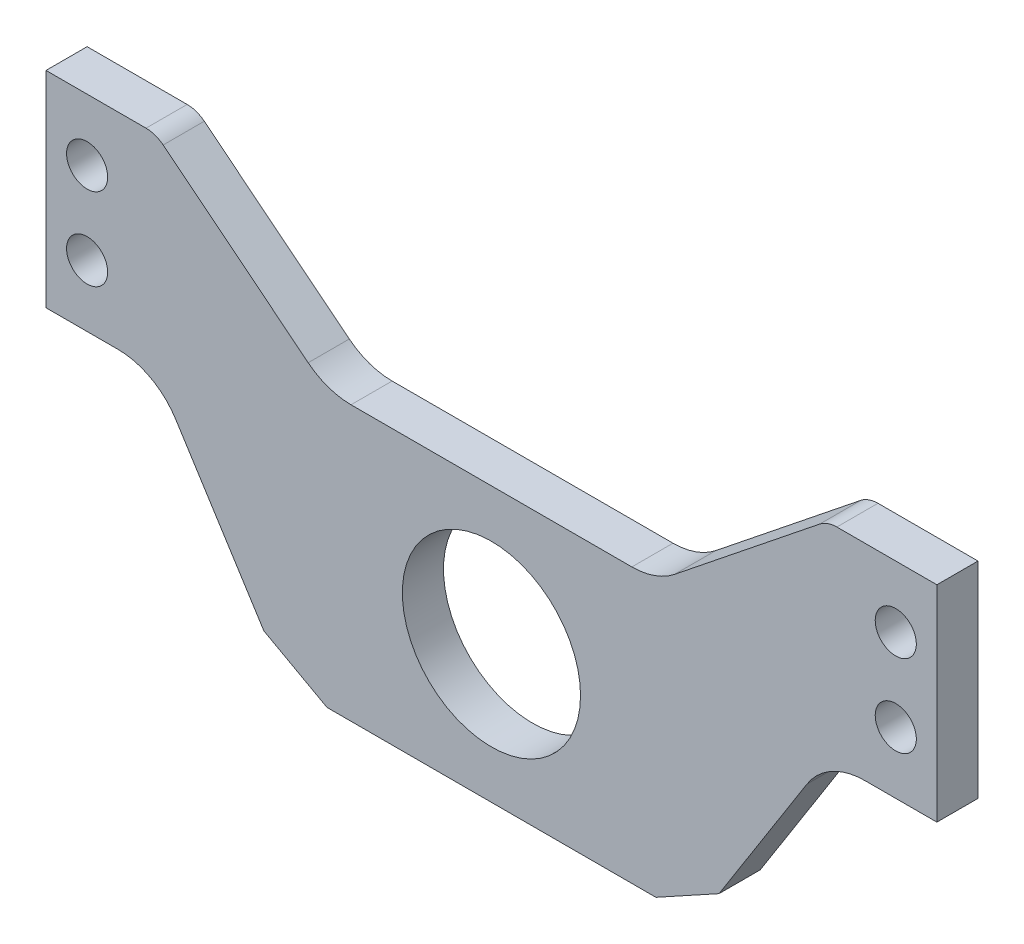
ISO-10303-21;
HEADER;
FILE_DESCRIPTION(('STEP AP214'),'2;1');
FILE_NAME('part.step','',(''),(''),'','','');
FILE_SCHEMA(('AUTOMOTIVE_DESIGN { 1 0 10303 214 1 1 1 1 }'));
ENDSEC;
DATA;
#1=APPLICATION_CONTEXT('core data for automotive mechanical design processes');
#2=APPLICATION_PROTOCOL_DEFINITION('international standard','automotive_design',2000,#1);
#3=PRODUCT_CONTEXT('',#1,'mechanical');
#4=PRODUCT('Part','Part','',(#3));
#5=PRODUCT_RELATED_PRODUCT_CATEGORY('part','',(#4));
#6=PRODUCT_DEFINITION_FORMATION('','',#4);
#7=PRODUCT_DEFINITION_CONTEXT('part definition',#1,'design');
#8=PRODUCT_DEFINITION('design','',#6,#7);
#9=PRODUCT_DEFINITION_SHAPE('','',#8);
#10=(LENGTH_UNIT() NAMED_UNIT(*) SI_UNIT(.MILLI.,.METRE.));
#11=(NAMED_UNIT(*) PLANE_ANGLE_UNIT() SI_UNIT($,.RADIAN.));
#12=(NAMED_UNIT(*) SI_UNIT($,.STERADIAN.) SOLID_ANGLE_UNIT());
#13=UNCERTAINTY_MEASURE_WITH_UNIT(LENGTH_MEASURE(1.E-05),#10,'distance_accuracy_value','');
#14=(GEOMETRIC_REPRESENTATION_CONTEXT(3) GLOBAL_UNCERTAINTY_ASSIGNED_CONTEXT((#13)) GLOBAL_UNIT_ASSIGNED_CONTEXT((#10,
#11,#12)) REPRESENTATION_CONTEXT('',''));
#15=CARTESIAN_POINT('',(0.,0.,0.));
#16=DIRECTION('',(0.,0.,1.));
#17=DIRECTION('',(1.,0.,0.));
#18=AXIS2_PLACEMENT_3D('',#15,#16,#17);
#19=CARTESIAN_POINT('',(0.,0.,3.));
#20=DIRECTION('',(0.,0.,-1.));
#21=DIRECTION('',(-1.,0.,0.));
#22=AXIS2_PLACEMENT_3D('',#19,#20,#21);
#23=PLANE('',#22);
#24=DIRECTION('',(-1.,0.,0.));
#25=VECTOR('',#24,1.);
#26=CARTESIAN_POINT('',(24.5,20.,3.));
#27=LINE('',#26,#25);
#28=CARTESIAN_POINT('',(32.5,20.,3.));
#29=VERTEX_POINT('',#28);
#30=CARTESIAN_POINT('',(25.2015621187164,20.,3.));
#31=VERTEX_POINT('',#30);
#32=EDGE_CURVE('E197',#29,#31,#27,.T.);
#33=ORIENTED_EDGE('',*,*,#32,.T.);
#34=CARTESIAN_POINT('',(25.2015621187164,18.,3.));
#35=DIRECTION('',(0.,0.,-1.));
#36=DIRECTION('',(-1.,0.,0.));
#37=AXIS2_PLACEMENT_3D('',#34,#35,#36);
#38=CIRCLE('',#37,2.);
#39=CARTESIAN_POINT('',(23.9521720236076,19.5617376188861,3.));
#40=VERTEX_POINT('',#39);
#41=EDGE_CURVE('E318',#31,#40,#38,.F.);
#42=ORIENTED_EDGE('',*,*,#41,.T.);
#43=DIRECTION('',(-0.78086880944303,-0.624695047554424,0.));
#44=VECTOR('',#43,1.);
#45=CARTESIAN_POINT('',(12.,10.,3.));
#46=LINE('',#45,#44);
#47=CARTESIAN_POINT('',(13.3695699409811,11.0956559527848,3.));
#48=VERTEX_POINT('',#47);
#49=EDGE_CURVE('E199',#40,#48,#46,.T.);
#50=ORIENTED_EDGE('',*,*,#49,.T.);
#51=CARTESIAN_POINT('',(10.2460947032089,15.,3.));
#52=DIRECTION('',(0.,0.,-1.));
#53=DIRECTION('',(-1.,0.,0.));
#54=AXIS2_PLACEMENT_3D('',#51,#52,#53);
#55=CIRCLE('',#54,5.);
#56=CARTESIAN_POINT('',(10.2460947032089,10.,3.));
#57=VERTEX_POINT('',#56);
#58=EDGE_CURVE('E266',#48,#57,#55,.T.);
#59=ORIENTED_EDGE('',*,*,#58,.T.);
#60=DIRECTION('',(-1.,0.,0.));
#61=VECTOR('',#60,1.);
#62=CARTESIAN_POINT('',(12.,10.,3.));
#63=LINE('',#62,#61);
#64=CARTESIAN_POINT('',(-10.2460947032089,10.,3.));
#65=VERTEX_POINT('',#64);
#66=EDGE_CURVE('E204',#57,#65,#63,.T.);
#67=ORIENTED_EDGE('',*,*,#66,.T.);
#68=CARTESIAN_POINT('',(-10.2460947032089,15.,3.));
#69=DIRECTION('',(0.,0.,-1.));
#70=DIRECTION('',(-1.,0.,0.));
#71=AXIS2_PLACEMENT_3D('',#68,#69,#70);
#72=CIRCLE('',#71,5.);
#73=CARTESIAN_POINT('',(-13.3695699409811,11.0956559527848,3.));
#74=VERTEX_POINT('',#73);
#75=EDGE_CURVE('E270',#65,#74,#72,.T.);
#76=ORIENTED_EDGE('',*,*,#75,.T.);
#77=DIRECTION('',(-0.78086880944303,0.624695047554424,0.));
#78=VECTOR('',#77,1.);
#79=CARTESIAN_POINT('',(-12.,10.,3.));
#80=LINE('',#79,#78);
#81=CARTESIAN_POINT('',(-23.9521720236076,19.5617376188861,3.));
#82=VERTEX_POINT('',#81);
#83=EDGE_CURVE('E207',#74,#82,#80,.T.);
#84=ORIENTED_EDGE('',*,*,#83,.T.);
#85=CARTESIAN_POINT('',(-25.2015621187164,18.,3.));
#86=DIRECTION('',(0.,0.,-1.));
#87=DIRECTION('',(-1.,0.,0.));
#88=AXIS2_PLACEMENT_3D('',#85,#86,#87);
#89=CIRCLE('',#88,2.);
#90=CARTESIAN_POINT('',(-25.2015621187164,20.,3.));
#91=VERTEX_POINT('',#90);
#92=EDGE_CURVE('E49',#82,#91,#89,.F.);
#93=ORIENTED_EDGE('',*,*,#92,.T.);
#94=DIRECTION('',(-1.,0.,0.));
#95=VECTOR('',#94,1.);
#96=CARTESIAN_POINT('',(-24.5,20.,3.));
#97=LINE('',#96,#95);
#98=CARTESIAN_POINT('',(-32.5,20.,3.));
#99=VERTEX_POINT('',#98);
#100=EDGE_CURVE('E209',#91,#99,#97,.T.);
#101=ORIENTED_EDGE('',*,*,#100,.T.);
#102=DIRECTION('',(0.,-1.,0.));
#103=VECTOR('',#102,1.);
#104=CARTESIAN_POINT('',(-32.5,20.,3.));
#105=LINE('',#104,#103);
#106=CARTESIAN_POINT('',(-32.5,4.99999999999999,3.));
#107=VERTEX_POINT('',#106);
#108=EDGE_CURVE('E211',#99,#107,#105,.T.);
#109=ORIENTED_EDGE('',*,*,#108,.T.);
#110=DIRECTION('',(1.,0.,0.));
#111=VECTOR('',#110,1.);
#112=CARTESIAN_POINT('',(-32.5,4.99999999999999,3.));
#113=LINE('',#112,#111);
#114=CARTESIAN_POINT('',(-27.2517603015216,4.99999999999999,3.));
#115=VERTEX_POINT('',#114);
#116=EDGE_CURVE('E213',#107,#115,#113,.T.);
#117=ORIENTED_EDGE('',*,*,#116,.T.);
#118=CARTESIAN_POINT('',(-27.2517603015216,0.,3.));
#119=DIRECTION('',(0.,0.,-1.));
#120=DIRECTION('',(-1.,0.,0.));
#121=AXIS2_PLACEMENT_3D('',#118,#119,#120);
#122=CIRCLE('',#121,5.);
#123=CARTESIAN_POINT('',(-23.0276649237504,2.67526040592171,3.));
#124=VERTEX_POINT('',#123);
#125=EDGE_CURVE('E306',#115,#124,#122,.T.);
#126=ORIENTED_EDGE('',*,*,#125,.T.);
#127=DIRECTION('',(0.535052081184345,-0.844819075554228,0.));
#128=VECTOR('',#127,1.);
#129=CARTESIAN_POINT('',(-15.,-10.,3.));
#130=LINE('',#129,#128);
#131=CARTESIAN_POINT('',(-16.605156243553,-7.46554277333729,3.));
#132=VERTEX_POINT('',#131);
#133=EDGE_CURVE('E246',#124,#132,#130,.T.);
#134=ORIENTED_EDGE('',*,*,#133,.T.);
#135=DIRECTION('',(-0.876085635421659,0.482155534457324,0.));
#136=VECTOR('',#135,1.);
#137=CARTESIAN_POINT('',(-12.,-10.,3.));
#138=LINE('',#137,#136);
#139=CARTESIAN_POINT('',(-12.,-10.,3.));
#140=VERTEX_POINT('',#139);
#141=EDGE_CURVE('E285',#132,#140,#138,.F.);
#142=ORIENTED_EDGE('',*,*,#141,.T.);
#143=DIRECTION('',(1.,0.,0.));
#144=VECTOR('',#143,1.);
#145=CARTESIAN_POINT('',(15.,-10.,3.));
#146=LINE('',#145,#144);
#147=CARTESIAN_POINT('',(12.,-10.,3.));
#148=VERTEX_POINT('',#147);
#149=EDGE_CURVE('E357',#140,#148,#146,.T.);
#150=ORIENTED_EDGE('',*,*,#149,.T.);
#151=DIRECTION('',(-0.876085635421659,-0.482155534457325,0.));
#152=VECTOR('',#151,1.);
#153=CARTESIAN_POINT('',(16.6051562435531,-7.46554277333729,3.));
#154=LINE('',#153,#152);
#155=CARTESIAN_POINT('',(16.6051562435531,-7.46554277333729,3.));
#156=VERTEX_POINT('',#155);
#157=EDGE_CURVE('E287',#148,#156,#154,.F.);
#158=ORIENTED_EDGE('',*,*,#157,.T.);
#159=DIRECTION('',(0.535052081184345,0.844819075554228,0.));
#160=VECTOR('',#159,1.);
#161=CARTESIAN_POINT('',(15.,-10.,3.));
#162=LINE('',#161,#160);
#163=CARTESIAN_POINT('',(23.0276649237504,2.67526040592173,3.));
#164=VERTEX_POINT('',#163);
#165=EDGE_CURVE('E182',#156,#164,#162,.T.);
#166=ORIENTED_EDGE('',*,*,#165,.T.);
#167=CARTESIAN_POINT('',(27.2517603015216,0.,3.));
#168=DIRECTION('',(0.,0.,-1.));
#169=DIRECTION('',(-1.,0.,0.));
#170=AXIS2_PLACEMENT_3D('',#167,#168,#169);
#171=CIRCLE('',#170,5.);
#172=CARTESIAN_POINT('',(27.2517603015216,5.,3.));
#173=VERTEX_POINT('',#172);
#174=EDGE_CURVE('E178',#164,#173,#171,.T.);
#175=ORIENTED_EDGE('',*,*,#174,.T.);
#176=DIRECTION('',(1.,0.,0.));
#177=VECTOR('',#176,1.);
#178=CARTESIAN_POINT('',(32.5,5.,3.));
#179=LINE('',#178,#177);
#180=CARTESIAN_POINT('',(32.5,5.,3.));
#181=VERTEX_POINT('',#180);
#182=EDGE_CURVE('E169',#173,#181,#179,.T.);
#183=ORIENTED_EDGE('',*,*,#182,.T.);
#184=DIRECTION('',(0.,1.,0.));
#185=VECTOR('',#184,1.);
#186=CARTESIAN_POINT('',(32.5,20.,3.));
#187=LINE('',#186,#185);
#188=EDGE_CURVE('E174',#181,#29,#187,.T.);
#189=ORIENTED_EDGE('',*,*,#188,.T.);
#190=EDGE_LOOP('',(#33,#42,#50,#59,#67,#76,#84,#93,#101,#109,#117,#126,#134,#142,#150,#158,#166,
#175,#183,#189));
#191=FACE_BOUND('',#190,.T.);
#192=CARTESIAN_POINT('',(0.,0.,3.));
#193=DIRECTION('',(0.,0.,1.));
#194=DIRECTION('',(1.,0.,0.));
#195=AXIS2_PLACEMENT_3D('',#192,#193,#194);
#196=CIRCLE('',#195,6.5);
#197=CARTESIAN_POINT('',(6.5,0.,3.));
#198=VERTEX_POINT('',#197);
#199=EDGE_CURVE('E220',#198,#198,#196,.T.);
#200=ORIENTED_EDGE('',*,*,#199,.F.);
#201=EDGE_LOOP('',(#200));
#202=FACE_BOUND('',#201,.T.);
#203=CARTESIAN_POINT('',(-29.5,15.5,3.));
#204=DIRECTION('',(0.,0.,1.));
#205=DIRECTION('',(1.,0.,0.));
#206=AXIS2_PLACEMENT_3D('',#203,#204,#205);
#207=CIRCLE('',#206,1.5);
#208=CARTESIAN_POINT('',(-28.,15.5,3.));
#209=VERTEX_POINT('',#208);
#210=EDGE_CURVE('E368',#209,#209,#207,.T.);
#211=ORIENTED_EDGE('',*,*,#210,.F.);
#212=EDGE_LOOP('',(#211));
#213=FACE_BOUND('',#212,.T.);
#214=CARTESIAN_POINT('',(-29.5,9.49999999999999,3.));
#215=DIRECTION('',(0.,0.,1.));
#216=DIRECTION('',(1.,0.,0.));
#217=AXIS2_PLACEMENT_3D('',#214,#215,#216);
#218=CIRCLE('',#217,1.5);
#219=CARTESIAN_POINT('',(-28.,9.49999999999999,3.));
#220=VERTEX_POINT('',#219);
#221=EDGE_CURVE('E374',#220,#220,#218,.T.);
#222=ORIENTED_EDGE('',*,*,#221,.F.);
#223=EDGE_LOOP('',(#222));
#224=FACE_BOUND('',#223,.T.);
#225=CARTESIAN_POINT('',(29.5,9.5,3.));
#226=DIRECTION('',(0.,0.,1.));
#227=DIRECTION('',(-1.,0.,0.));
#228=AXIS2_PLACEMENT_3D('',#225,#226,#227);
#229=CIRCLE('',#228,1.5);
#230=CARTESIAN_POINT('',(28.,9.5,3.));
#231=VERTEX_POINT('',#230);
#232=EDGE_CURVE('E380',#231,#231,#229,.T.);
#233=ORIENTED_EDGE('',*,*,#232,.F.);
#234=EDGE_LOOP('',(#233));
#235=FACE_BOUND('',#234,.T.);
#236=CARTESIAN_POINT('',(29.5,15.5,3.));
#237=DIRECTION('',(0.,0.,1.));
#238=DIRECTION('',(-1.,0.,0.));
#239=AXIS2_PLACEMENT_3D('',#236,#237,#238);
#240=CIRCLE('',#239,1.5);
#241=CARTESIAN_POINT('',(28.,15.5,3.));
#242=VERTEX_POINT('',#241);
#243=EDGE_CURVE('E386',#242,#242,#240,.T.);
#244=ORIENTED_EDGE('',*,*,#243,.F.);
#245=EDGE_LOOP('',(#244));
#246=FACE_BOUND('',#245,.T.);
#247=ADVANCED_FACE('F34',(#191,#202,#213,#224,#235,#246),#23,.F.);
#248=CARTESIAN_POINT('',(0.,0.,0.));
#249=DIRECTION('',(0.,0.,-1.));
#250=DIRECTION('',(-1.,0.,0.));
#251=AXIS2_PLACEMENT_3D('',#248,#249,#250);
#252=PLANE('',#251);
#253=CARTESIAN_POINT('',(29.5,9.5,0.));
#254=DIRECTION('',(0.,0.,1.));
#255=DIRECTION('',(-1.,0.,0.));
#256=AXIS2_PLACEMENT_3D('',#253,#254,#255);
#257=CIRCLE('',#256,1.5);
#258=CARTESIAN_POINT('',(28.,9.5,0.));
#259=VERTEX_POINT('',#258);
#260=EDGE_CURVE('E383',#259,#259,#257,.T.);
#261=ORIENTED_EDGE('',*,*,#260,.T.);
#262=EDGE_LOOP('',(#261));
#263=FACE_BOUND('',#262,.T.);
#264=CARTESIAN_POINT('',(-29.5,15.5,0.));
#265=DIRECTION('',(0.,0.,1.));
#266=DIRECTION('',(1.,0.,0.));
#267=AXIS2_PLACEMENT_3D('',#264,#265,#266);
#268=CIRCLE('',#267,1.5);
#269=CARTESIAN_POINT('',(-28.,15.5,0.));
#270=VERTEX_POINT('',#269);
#271=EDGE_CURVE('E371',#270,#270,#268,.T.);
#272=ORIENTED_EDGE('',*,*,#271,.T.);
#273=EDGE_LOOP('',(#272));
#274=FACE_BOUND('',#273,.T.);
#275=DIRECTION('',(-0.78086880944303,-0.624695047554424,0.));
#276=VECTOR('',#275,1.);
#277=CARTESIAN_POINT('',(12.,10.,0.));
#278=LINE('',#277,#276);
#279=CARTESIAN_POINT('',(23.9521720236076,19.5617376188861,0.));
#280=VERTEX_POINT('',#279);
#281=CARTESIAN_POINT('',(13.3695699409811,11.0956559527848,0.));
#282=VERTEX_POINT('',#281);
#283=EDGE_CURVE('E232',#280,#282,#278,.T.);
#284=ORIENTED_EDGE('',*,*,#283,.F.);
#285=CARTESIAN_POINT('',(25.2015621187164,18.,0.));
#286=DIRECTION('',(0.,0.,-1.));
#287=DIRECTION('',(-1.,0.,0.));
#288=AXIS2_PLACEMENT_3D('',#285,#286,#287);
#289=CIRCLE('',#288,2.);
#290=CARTESIAN_POINT('',(25.2015621187164,20.,0.));
#291=VERTEX_POINT('',#290);
#292=EDGE_CURVE('E313',#280,#291,#289,.T.);
#293=ORIENTED_EDGE('',*,*,#292,.T.);
#294=DIRECTION('',(-1.,0.,0.));
#295=VECTOR('',#294,1.);
#296=CARTESIAN_POINT('',(24.5,20.,0.));
#297=LINE('',#296,#295);
#298=CARTESIAN_POINT('',(32.5,20.,0.));
#299=VERTEX_POINT('',#298);
#300=EDGE_CURVE('E229',#299,#291,#297,.T.);
#301=ORIENTED_EDGE('',*,*,#300,.F.);
#302=DIRECTION('',(0.,1.,0.));
#303=VECTOR('',#302,1.);
#304=CARTESIAN_POINT('',(32.5,20.,0.));
#305=LINE('',#304,#303);
#306=CARTESIAN_POINT('',(32.5,5.,0.));
#307=VERTEX_POINT('',#306);
#308=EDGE_CURVE('E227',#307,#299,#305,.T.);
#309=ORIENTED_EDGE('',*,*,#308,.F.);
#310=DIRECTION('',(1.,0.,0.));
#311=VECTOR('',#310,1.);
#312=CARTESIAN_POINT('',(32.5,5.,0.));
#313=LINE('',#312,#311);
#314=CARTESIAN_POINT('',(27.2517603015216,5.,0.));
#315=VERTEX_POINT('',#314);
#316=EDGE_CURVE('E188',#315,#307,#313,.T.);
#317=ORIENTED_EDGE('',*,*,#316,.F.);
#318=CARTESIAN_POINT('',(27.2517603015216,0.,0.));
#319=DIRECTION('',(0.,0.,-1.));
#320=DIRECTION('',(-1.,0.,0.));
#321=AXIS2_PLACEMENT_3D('',#318,#319,#320);
#322=CIRCLE('',#321,5.);
#323=CARTESIAN_POINT('',(23.0276649237504,2.67526040592173,0.));
#324=VERTEX_POINT('',#323);
#325=EDGE_CURVE('E301',#315,#324,#322,.F.);
#326=ORIENTED_EDGE('',*,*,#325,.T.);
#327=DIRECTION('',(0.535052081184345,0.844819075554228,0.));
#328=VECTOR('',#327,1.);
#329=CARTESIAN_POINT('',(15.,-10.,0.));
#330=LINE('',#329,#328);
#331=CARTESIAN_POINT('',(16.6051562435531,-7.46554277333729,0.));
#332=VERTEX_POINT('',#331);
#333=EDGE_CURVE('E223',#332,#324,#330,.T.);
#334=ORIENTED_EDGE('',*,*,#333,.F.);
#335=DIRECTION('',(0.876085635421659,0.482155534457325,0.));
#336=VECTOR('',#335,1.);
#337=CARTESIAN_POINT('',(7.01378289066508,-12.7441748592471,0.));
#338=LINE('',#337,#336);
#339=CARTESIAN_POINT('',(12.,-10.,0.));
#340=VERTEX_POINT('',#339);
#341=EDGE_CURVE('E278',#332,#340,#338,.F.);
#342=ORIENTED_EDGE('',*,*,#341,.T.);
#343=DIRECTION('',(1.,0.,0.));
#344=VECTOR('',#343,1.);
#345=CARTESIAN_POINT('',(15.,-10.,0.));
#346=LINE('',#345,#344);
#347=CARTESIAN_POINT('',(-12.,-10.,0.));
#348=VERTEX_POINT('',#347);
#349=EDGE_CURVE('E219',#348,#340,#346,.T.);
#350=ORIENTED_EDGE('',*,*,#349,.F.);
#351=DIRECTION('',(0.876085635421659,-0.482155534457324,0.));
#352=VECTOR('',#351,1.);
#353=CARTESIAN_POINT('',(-7.01378289066508,-12.7441748592471,0.));
#354=LINE('',#353,#352);
#355=CARTESIAN_POINT('',(-16.605156243553,-7.46554277333729,0.));
#356=VERTEX_POINT('',#355);
#357=EDGE_CURVE('E275',#348,#356,#354,.F.);
#358=ORIENTED_EDGE('',*,*,#357,.T.);
#359=DIRECTION('',(0.535052081184345,-0.844819075554228,0.));
#360=VECTOR('',#359,1.);
#361=CARTESIAN_POINT('',(-15.,-10.,0.));
#362=LINE('',#361,#360);
#363=CARTESIAN_POINT('',(-23.0276649237504,2.67526040592171,0.));
#364=VERTEX_POINT('',#363);
#365=EDGE_CURVE('E217',#364,#356,#362,.T.);
#366=ORIENTED_EDGE('',*,*,#365,.F.);
#367=CARTESIAN_POINT('',(-27.2517603015216,0.,0.));
#368=DIRECTION('',(0.,0.,-1.));
#369=DIRECTION('',(-1.,0.,0.));
#370=AXIS2_PLACEMENT_3D('',#367,#368,#369);
#371=CIRCLE('',#370,5.);
#372=CARTESIAN_POINT('',(-27.2517603015216,4.99999999999999,0.));
#373=VERTEX_POINT('',#372);
#374=EDGE_CURVE('E304',#364,#373,#371,.F.);
#375=ORIENTED_EDGE('',*,*,#374,.T.);
#376=DIRECTION('',(1.,0.,0.));
#377=VECTOR('',#376,1.);
#378=CARTESIAN_POINT('',(-32.5,4.99999999999999,0.));
#379=LINE('',#378,#377);
#380=CARTESIAN_POINT('',(-32.5,4.99999999999999,0.));
#381=VERTEX_POINT('',#380);
#382=EDGE_CURVE('E243',#381,#373,#379,.T.);
#383=ORIENTED_EDGE('',*,*,#382,.F.);
#384=DIRECTION('',(0.,-1.,0.));
#385=VECTOR('',#384,1.);
#386=CARTESIAN_POINT('',(-32.5,20.,0.));
#387=LINE('',#386,#385);
#388=CARTESIAN_POINT('',(-32.5,20.,0.));
#389=VERTEX_POINT('',#388);
#390=EDGE_CURVE('E241',#389,#381,#387,.T.);
#391=ORIENTED_EDGE('',*,*,#390,.F.);
#392=DIRECTION('',(-1.,0.,0.));
#393=VECTOR('',#392,1.);
#394=CARTESIAN_POINT('',(-24.5,20.,0.));
#395=LINE('',#394,#393);
#396=CARTESIAN_POINT('',(-25.2015621187164,20.,0.));
#397=VERTEX_POINT('',#396);
#398=EDGE_CURVE('E239',#397,#389,#395,.T.);
#399=ORIENTED_EDGE('',*,*,#398,.F.);
#400=CARTESIAN_POINT('',(-25.2015621187164,18.,0.));
#401=DIRECTION('',(0.,0.,-1.));
#402=DIRECTION('',(-1.,0.,0.));
#403=AXIS2_PLACEMENT_3D('',#400,#401,#402);
#404=CIRCLE('',#403,2.);
#405=CARTESIAN_POINT('',(-23.9521720236076,19.5617376188861,0.));
#406=VERTEX_POINT('',#405);
#407=EDGE_CURVE('E311',#397,#406,#404,.T.);
#408=ORIENTED_EDGE('',*,*,#407,.T.);
#409=DIRECTION('',(-0.78086880944303,0.624695047554424,0.));
#410=VECTOR('',#409,1.);
#411=CARTESIAN_POINT('',(-12.,10.,0.));
#412=LINE('',#411,#410);
#413=CARTESIAN_POINT('',(-13.3695699409811,11.0956559527848,0.));
#414=VERTEX_POINT('',#413);
#415=EDGE_CURVE('E237',#414,#406,#412,.T.);
#416=ORIENTED_EDGE('',*,*,#415,.F.);
#417=CARTESIAN_POINT('',(-10.2460947032089,15.,0.));
#418=DIRECTION('',(0.,0.,-1.));
#419=DIRECTION('',(-1.,0.,0.));
#420=AXIS2_PLACEMENT_3D('',#417,#418,#419);
#421=CIRCLE('',#420,5.);
#422=CARTESIAN_POINT('',(-10.2460947032089,10.,0.));
#423=VERTEX_POINT('',#422);
#424=EDGE_CURVE('E268',#414,#423,#421,.F.);
#425=ORIENTED_EDGE('',*,*,#424,.T.);
#426=DIRECTION('',(-1.,0.,0.));
#427=VECTOR('',#426,1.);
#428=CARTESIAN_POINT('',(12.,10.,0.));
#429=LINE('',#428,#427);
#430=CARTESIAN_POINT('',(10.2460947032089,10.,0.));
#431=VERTEX_POINT('',#430);
#432=EDGE_CURVE('E234',#431,#423,#429,.T.);
#433=ORIENTED_EDGE('',*,*,#432,.F.);
#434=CARTESIAN_POINT('',(10.2460947032089,15.,0.));
#435=DIRECTION('',(0.,0.,-1.));
#436=DIRECTION('',(-1.,0.,0.));
#437=AXIS2_PLACEMENT_3D('',#434,#435,#436);
#438=CIRCLE('',#437,5.);
#439=EDGE_CURVE('E263',#431,#282,#438,.F.);
#440=ORIENTED_EDGE('',*,*,#439,.T.);
#441=EDGE_LOOP('',(#284,#293,#301,#309,#317,#326,#334,#342,#350,#358,#366,#375,#383,#391,#399,
#408,#416,#425,#433,#440));
#442=FACE_BOUND('',#441,.T.);
#443=CARTESIAN_POINT('',(0.,0.,0.));
#444=DIRECTION('',(0.,0.,1.));
#445=DIRECTION('',(1.,0.,0.));
#446=AXIS2_PLACEMENT_3D('',#443,#444,#445);
#447=CIRCLE('',#446,6.5);
#448=CARTESIAN_POINT('',(6.5,0.,0.));
#449=VERTEX_POINT('',#448);
#450=EDGE_CURVE('E365',#449,#449,#447,.T.);
#451=ORIENTED_EDGE('',*,*,#450,.T.);
#452=EDGE_LOOP('',(#451));
#453=FACE_BOUND('',#452,.T.);
#454=CARTESIAN_POINT('',(-29.5,9.49999999999999,0.));
#455=DIRECTION('',(0.,0.,1.));
#456=DIRECTION('',(1.,0.,0.));
#457=AXIS2_PLACEMENT_3D('',#454,#455,#456);
#458=CIRCLE('',#457,1.5);
#459=CARTESIAN_POINT('',(-28.,9.49999999999999,0.));
#460=VERTEX_POINT('',#459);
#461=EDGE_CURVE('E377',#460,#460,#458,.T.);
#462=ORIENTED_EDGE('',*,*,#461,.T.);
#463=EDGE_LOOP('',(#462));
#464=FACE_BOUND('',#463,.T.);
#465=CARTESIAN_POINT('',(29.5,15.5,0.));
#466=DIRECTION('',(0.,0.,1.));
#467=DIRECTION('',(-1.,0.,0.));
#468=AXIS2_PLACEMENT_3D('',#465,#466,#467);
#469=CIRCLE('',#468,1.5);
#470=CARTESIAN_POINT('',(28.,15.5,0.));
#471=VERTEX_POINT('',#470);
#472=EDGE_CURVE('E389',#471,#471,#469,.T.);
#473=ORIENTED_EDGE('',*,*,#472,.T.);
#474=EDGE_LOOP('',(#473));
#475=FACE_BOUND('',#474,.T.);
#476=ADVANCED_FACE('F329',(#263,#274,#442,#453,#464,#475),#252,.T.);
#477=CARTESIAN_POINT('',(-15.,-10.,3.));
#478=DIRECTION('',(0.844819075554228,0.535052081184345,0.));
#479=DIRECTION('',(-0.535052081184345,0.844819075554228,0.));
#480=AXIS2_PLACEMENT_3D('',#477,#478,#479);
#481=PLANE('',#480);
#482=ORIENTED_EDGE('',*,*,#133,.F.);
#483=DIRECTION('',(0.,0.,-1.));
#484=VECTOR('',#483,1.);
#485=CARTESIAN_POINT('',(-23.0276649237504,2.67526040592172,0.));
#486=LINE('',#485,#484);
#487=EDGE_CURVE('E296',#124,#364,#486,.T.);
#488=ORIENTED_EDGE('',*,*,#487,.T.);
#489=ORIENTED_EDGE('',*,*,#365,.T.);
#490=DIRECTION('',(0.,0.,1.));
#491=VECTOR('',#490,1.);
#492=CARTESIAN_POINT('',(-16.605156243553,-7.46554277333729,3.));
#493=LINE('',#492,#491);
#494=EDGE_CURVE('E289',#356,#132,#493,.T.);
#495=ORIENTED_EDGE('',*,*,#494,.T.);
#496=EDGE_LOOP('',(#482,#488,#489,#495));
#497=FACE_BOUND('',#496,.T.);
#498=ADVANCED_FACE('F348',(#497),#481,.F.);
#499=CARTESIAN_POINT('',(15.,-10.,3.));
#500=DIRECTION('',(0.,1.,0.));
#501=DIRECTION('',(-1.,0.,0.));
#502=AXIS2_PLACEMENT_3D('',#499,#500,#501);
#503=PLANE('',#502);
#504=ORIENTED_EDGE('',*,*,#349,.T.);
#505=DIRECTION('',(0.,0.,1.));
#506=VECTOR('',#505,1.);
#507=CARTESIAN_POINT('',(12.,-10.,3.));
#508=LINE('',#507,#506);
#509=EDGE_CURVE('E283',#340,#148,#508,.T.);
#510=ORIENTED_EDGE('',*,*,#509,.T.);
#511=ORIENTED_EDGE('',*,*,#149,.F.);
#512=DIRECTION('',(0.,0.,-1.));
#513=VECTOR('',#512,1.);
#514=CARTESIAN_POINT('',(-12.,-10.,3.));
#515=LINE('',#514,#513);
#516=EDGE_CURVE('E280',#140,#348,#515,.T.);
#517=ORIENTED_EDGE('',*,*,#516,.T.);
#518=EDGE_LOOP('',(#504,#510,#511,#517));
#519=FACE_BOUND('',#518,.T.);
#520=ADVANCED_FACE('F360',(#519),#503,.F.);
#521=CARTESIAN_POINT('',(15.,-10.,3.));
#522=DIRECTION('',(-0.844819075554228,0.535052081184345,0.));
#523=DIRECTION('',(-0.535052081184345,-0.844819075554228,0.));
#524=AXIS2_PLACEMENT_3D('',#521,#522,#523);
#525=PLANE('',#524);
#526=ORIENTED_EDGE('',*,*,#333,.T.);
#527=DIRECTION('',(0.,0.,-1.));
#528=VECTOR('',#527,1.);
#529=CARTESIAN_POINT('',(23.0276649237504,2.67526040592172,3.));
#530=LINE('',#529,#528);
#531=EDGE_CURVE('E294',#324,#164,#530,.F.);
#532=ORIENTED_EDGE('',*,*,#531,.T.);
#533=ORIENTED_EDGE('',*,*,#165,.F.);
#534=DIRECTION('',(0.,0.,-1.));
#535=VECTOR('',#534,1.);
#536=CARTESIAN_POINT('',(16.6051562435531,-7.46554277333729,3.));
#537=LINE('',#536,#535);
#538=EDGE_CURVE('E272',#156,#332,#537,.T.);
#539=ORIENTED_EDGE('',*,*,#538,.T.);
#540=EDGE_LOOP('',(#526,#532,#533,#539));
#541=FACE_BOUND('',#540,.T.);
#542=ADVANCED_FACE('F434',(#541),#525,.F.);
#543=CARTESIAN_POINT('',(32.5,5.,3.));
#544=DIRECTION('',(0.,1.,0.));
#545=DIRECTION('',(-1.,0.,0.));
#546=AXIS2_PLACEMENT_3D('',#543,#544,#545);
#547=PLANE('',#546);
#548=ORIENTED_EDGE('',*,*,#182,.F.);
#549=DIRECTION('',(0.,0.,-1.));
#550=VECTOR('',#549,1.);
#551=CARTESIAN_POINT('',(27.2517603015216,5.,0.));
#552=LINE('',#551,#550);
#553=EDGE_CURVE('E292',#173,#315,#552,.T.);
#554=ORIENTED_EDGE('',*,*,#553,.T.);
#555=ORIENTED_EDGE('',*,*,#316,.T.);
#556=DIRECTION('',(0.,0.,-1.));
#557=VECTOR('',#556,1.);
#558=CARTESIAN_POINT('',(32.5,5.,3.));
#559=LINE('',#558,#557);
#560=EDGE_CURVE('E185',#181,#307,#559,.T.);
#561=ORIENTED_EDGE('',*,*,#560,.F.);
#562=EDGE_LOOP('',(#548,#554,#555,#561));
#563=FACE_BOUND('',#562,.T.);
#564=ADVANCED_FACE('F186',(#563),#547,.F.);
#565=CARTESIAN_POINT('',(32.5,20.,3.));
#566=DIRECTION('',(-1.,0.,0.));
#567=DIRECTION('',(0.,0.,1.));
#568=AXIS2_PLACEMENT_3D('',#565,#566,#567);
#569=PLANE('',#568);
#570=ORIENTED_EDGE('',*,*,#308,.T.);
#571=DIRECTION('',(0.,0.,-1.));
#572=VECTOR('',#571,1.);
#573=CARTESIAN_POINT('',(32.5,20.,3.));
#574=LINE('',#573,#572);
#575=EDGE_CURVE('E192',#29,#299,#574,.T.);
#576=ORIENTED_EDGE('',*,*,#575,.F.);
#577=ORIENTED_EDGE('',*,*,#188,.F.);
#578=ORIENTED_EDGE('',*,*,#560,.T.);
#579=EDGE_LOOP('',(#570,#576,#577,#578));
#580=FACE_BOUND('',#579,.T.);
#581=ADVANCED_FACE('F194',(#580),#569,.F.);
#582=CARTESIAN_POINT('',(24.5,20.,3.));
#583=DIRECTION('',(0.,-1.,0.));
#584=DIRECTION('',(0.,0.,-1.));
#585=AXIS2_PLACEMENT_3D('',#582,#583,#584);
#586=PLANE('',#585);
#587=ORIENTED_EDGE('',*,*,#300,.T.);
#588=DIRECTION('',(0.,0.,-1.));
#589=VECTOR('',#588,1.);
#590=CARTESIAN_POINT('',(25.2015621187164,20.,3.));
#591=LINE('',#590,#589);
#592=EDGE_CURVE('E315',#291,#31,#591,.F.);
#593=ORIENTED_EDGE('',*,*,#592,.T.);
#594=ORIENTED_EDGE('',*,*,#32,.F.);
#595=ORIENTED_EDGE('',*,*,#575,.T.);
#596=EDGE_LOOP('',(#587,#593,#594,#595));
#597=FACE_BOUND('',#596,.T.);
#598=ADVANCED_FACE('F425',(#597),#586,.F.);
#599=CARTESIAN_POINT('',(12.,10.,3.));
#600=DIRECTION('',(0.624695047554424,-0.78086880944303,0.));
#601=DIRECTION('',(0.78086880944303,0.624695047554424,0.));
#602=AXIS2_PLACEMENT_3D('',#599,#600,#601);
#603=PLANE('',#602);
#604=ORIENTED_EDGE('',*,*,#49,.F.);
#605=DIRECTION('',(0.,0.,-1.));
#606=VECTOR('',#605,1.);
#607=CARTESIAN_POINT('',(23.9521720236076,19.5617376188861,3.));
#608=LINE('',#607,#606);
#609=EDGE_CURVE('E308',#40,#280,#608,.T.);
#610=ORIENTED_EDGE('',*,*,#609,.T.);
#611=ORIENTED_EDGE('',*,*,#283,.T.);
#612=DIRECTION('',(0.,0.,-1.));
#613=VECTOR('',#612,1.);
#614=CARTESIAN_POINT('',(13.3695699409811,11.0956559527848,3.));
#615=LINE('',#614,#613);
#616=EDGE_CURVE('E257',#282,#48,#615,.F.);
#617=ORIENTED_EDGE('',*,*,#616,.T.);
#618=EDGE_LOOP('',(#604,#610,#611,#617));
#619=FACE_BOUND('',#618,.T.);
#620=ADVANCED_FACE('F421',(#619),#603,.F.);
#621=CARTESIAN_POINT('',(12.,10.,3.));
#622=DIRECTION('',(0.,-1.,0.));
#623=DIRECTION('',(1.,0.,0.));
#624=AXIS2_PLACEMENT_3D('',#621,#622,#623);
#625=PLANE('',#624);
#626=ORIENTED_EDGE('',*,*,#66,.F.);
#627=DIRECTION('',(0.,0.,-1.));
#628=VECTOR('',#627,1.);
#629=CARTESIAN_POINT('',(10.2460947032089,10.,0.));
#630=LINE('',#629,#628);
#631=EDGE_CURVE('E254',#57,#431,#630,.T.);
#632=ORIENTED_EDGE('',*,*,#631,.T.);
#633=ORIENTED_EDGE('',*,*,#432,.T.);
#634=DIRECTION('',(0.,0.,-1.));
#635=VECTOR('',#634,1.);
#636=CARTESIAN_POINT('',(-10.2460947032089,10.,3.));
#637=LINE('',#636,#635);
#638=EDGE_CURVE('E191',#423,#65,#637,.F.);
#639=ORIENTED_EDGE('',*,*,#638,.T.);
#640=EDGE_LOOP('',(#626,#632,#633,#639));
#641=FACE_BOUND('',#640,.T.);
#642=ADVANCED_FACE('F418',(#641),#625,.F.);
#643=CARTESIAN_POINT('',(-12.,10.,3.));
#644=DIRECTION('',(-0.624695047554424,-0.78086880944303,0.));
#645=DIRECTION('',(0.78086880944303,-0.624695047554424,0.));
#646=AXIS2_PLACEMENT_3D('',#643,#644,#645);
#647=PLANE('',#646);
#648=ORIENTED_EDGE('',*,*,#415,.T.);
#649=DIRECTION('',(0.,0.,-1.));
#650=VECTOR('',#649,1.);
#651=CARTESIAN_POINT('',(-23.9521720236076,19.5617376188861,3.));
#652=LINE('',#651,#650);
#653=EDGE_CURVE('E11',#406,#82,#652,.F.);
#654=ORIENTED_EDGE('',*,*,#653,.T.);
#655=ORIENTED_EDGE('',*,*,#83,.F.);
#656=DIRECTION('',(0.,0.,-1.));
#657=VECTOR('',#656,1.);
#658=CARTESIAN_POINT('',(-13.3695699409811,11.0956559527848,0.));
#659=LINE('',#658,#657);
#660=EDGE_CURVE('E260',#74,#414,#659,.T.);
#661=ORIENTED_EDGE('',*,*,#660,.T.);
#662=EDGE_LOOP('',(#648,#654,#655,#661));
#663=FACE_BOUND('',#662,.T.);
#664=ADVANCED_FACE('F415',(#663),#647,.F.);
#665=CARTESIAN_POINT('',(-24.5,20.,3.));
#666=DIRECTION('',(0.,-1.,0.));
#667=DIRECTION('',(0.,0.,-1.));
#668=AXIS2_PLACEMENT_3D('',#665,#666,#667);
#669=PLANE('',#668);
#670=ORIENTED_EDGE('',*,*,#100,.F.);
#671=DIRECTION('',(0.,0.,-1.));
#672=VECTOR('',#671,1.);
#673=CARTESIAN_POINT('',(-25.2015621187164,20.,3.));
#674=LINE('',#673,#672);
#675=EDGE_CURVE('E42',#91,#397,#674,.T.);
#676=ORIENTED_EDGE('',*,*,#675,.T.);
#677=ORIENTED_EDGE('',*,*,#398,.T.);
#678=DIRECTION('',(0.,0.,-1.));
#679=VECTOR('',#678,1.);
#680=CARTESIAN_POINT('',(-32.5,20.,3.));
#681=LINE('',#680,#679);
#682=EDGE_CURVE('E249',#99,#389,#681,.T.);
#683=ORIENTED_EDGE('',*,*,#682,.F.);
#684=EDGE_LOOP('',(#670,#676,#677,#683));
#685=FACE_BOUND('',#684,.T.);
#686=ADVANCED_FACE('F323',(#685),#669,.F.);
#687=CARTESIAN_POINT('',(-32.5,20.,3.));
#688=DIRECTION('',(1.,0.,0.));
#689=DIRECTION('',(0.,0.,-1.));
#690=AXIS2_PLACEMENT_3D('',#687,#688,#689);
#691=PLANE('',#690);
#692=ORIENTED_EDGE('',*,*,#390,.T.);
#693=DIRECTION('',(0.,0.,-1.));
#694=VECTOR('',#693,1.);
#695=CARTESIAN_POINT('',(-32.5,4.99999999999999,3.));
#696=LINE('',#695,#694);
#697=EDGE_CURVE('E216',#107,#381,#696,.T.);
#698=ORIENTED_EDGE('',*,*,#697,.F.);
#699=ORIENTED_EDGE('',*,*,#108,.F.);
#700=ORIENTED_EDGE('',*,*,#682,.T.);
#701=EDGE_LOOP('',(#692,#698,#699,#700));
#702=FACE_BOUND('',#701,.T.);
#703=ADVANCED_FACE('F335',(#702),#691,.F.);
#704=CARTESIAN_POINT('',(-32.5,4.99999999999999,3.));
#705=DIRECTION('',(0.,1.,0.));
#706=DIRECTION('',(-1.,0.,0.));
#707=AXIS2_PLACEMENT_3D('',#704,#705,#706);
#708=PLANE('',#707);
#709=ORIENTED_EDGE('',*,*,#382,.T.);
#710=DIRECTION('',(0.,0.,-1.));
#711=VECTOR('',#710,1.);
#712=CARTESIAN_POINT('',(-27.2517603015216,4.99999999999999,3.));
#713=LINE('',#712,#711);
#714=EDGE_CURVE('E299',#373,#115,#713,.F.);
#715=ORIENTED_EDGE('',*,*,#714,.T.);
#716=ORIENTED_EDGE('',*,*,#116,.F.);
#717=ORIENTED_EDGE('',*,*,#697,.T.);
#718=EDGE_LOOP('',(#709,#715,#716,#717));
#719=FACE_BOUND('',#718,.T.);
#720=ADVANCED_FACE('F339',(#719),#708,.F.);
#721=CARTESIAN_POINT('',(0.,0.,3.));
#722=DIRECTION('',(0.,0.,-1.));
#723=DIRECTION('',(-1.,0.,0.));
#724=AXIS2_PLACEMENT_3D('',#721,#722,#723);
#725=CYLINDRICAL_SURFACE('',#724,6.5);
#726=ORIENTED_EDGE('',*,*,#199,.T.);
#727=EDGE_LOOP('',(#726));
#728=FACE_BOUND('',#727,.T.);
#729=ORIENTED_EDGE('',*,*,#450,.F.);
#730=EDGE_LOOP('',(#729));
#731=FACE_BOUND('',#730,.T.);
#732=ADVANCED_FACE('F406',(#728,#731),#725,.F.);
#733=CARTESIAN_POINT('',(-29.5,15.5,3.));
#734=DIRECTION('',(0.,0.,-1.));
#735=DIRECTION('',(-1.,0.,0.));
#736=AXIS2_PLACEMENT_3D('',#733,#734,#735);
#737=CYLINDRICAL_SURFACE('',#736,1.5);
#738=ORIENTED_EDGE('',*,*,#210,.T.);
#739=EDGE_LOOP('',(#738));
#740=FACE_BOUND('',#739,.T.);
#741=ORIENTED_EDGE('',*,*,#271,.F.);
#742=EDGE_LOOP('',(#741));
#743=FACE_BOUND('',#742,.T.);
#744=ADVANCED_FACE('F628',(#740,#743),#737,.F.);
#745=CARTESIAN_POINT('',(-29.5,9.49999999999999,3.));
#746=DIRECTION('',(0.,0.,-1.));
#747=DIRECTION('',(-1.,0.,0.));
#748=AXIS2_PLACEMENT_3D('',#745,#746,#747);
#749=CYLINDRICAL_SURFACE('',#748,1.5);
#750=ORIENTED_EDGE('',*,*,#221,.T.);
#751=EDGE_LOOP('',(#750));
#752=FACE_BOUND('',#751,.T.);
#753=ORIENTED_EDGE('',*,*,#461,.F.);
#754=EDGE_LOOP('',(#753));
#755=FACE_BOUND('',#754,.T.);
#756=ADVANCED_FACE('F618',(#752,#755),#749,.F.);
#757=CARTESIAN_POINT('',(29.5,9.5,3.));
#758=DIRECTION('',(0.,0.,-1.));
#759=DIRECTION('',(-1.,0.,0.));
#760=AXIS2_PLACEMENT_3D('',#757,#758,#759);
#761=CYLINDRICAL_SURFACE('',#760,1.5);
#762=ORIENTED_EDGE('',*,*,#232,.T.);
#763=EDGE_LOOP('',(#762));
#764=FACE_BOUND('',#763,.T.);
#765=ORIENTED_EDGE('',*,*,#260,.F.);
#766=EDGE_LOOP('',(#765));
#767=FACE_BOUND('',#766,.T.);
#768=ADVANCED_FACE('F609',(#764,#767),#761,.F.);
#769=CARTESIAN_POINT('',(29.5,15.5,3.));
#770=DIRECTION('',(0.,0.,-1.));
#771=DIRECTION('',(-1.,0.,0.));
#772=AXIS2_PLACEMENT_3D('',#769,#770,#771);
#773=CYLINDRICAL_SURFACE('',#772,1.5);
#774=ORIENTED_EDGE('',*,*,#243,.T.);
#775=EDGE_LOOP('',(#774));
#776=FACE_BOUND('',#775,.T.);
#777=ORIENTED_EDGE('',*,*,#472,.F.);
#778=EDGE_LOOP('',(#777));
#779=FACE_BOUND('',#778,.T.);
#780=ADVANCED_FACE('F395',(#776,#779),#773,.F.);
#781=CARTESIAN_POINT('',(10.2460947032089,15.,3.));
#782=DIRECTION('',(0.,0.,1.));
#783=DIRECTION('',(1.,0.,0.));
#784=AXIS2_PLACEMENT_3D('',#781,#782,#783);
#785=CYLINDRICAL_SURFACE('',#784,5.);
#786=ORIENTED_EDGE('',*,*,#58,.F.);
#787=ORIENTED_EDGE('',*,*,#616,.F.);
#788=ORIENTED_EDGE('',*,*,#439,.F.);
#789=ORIENTED_EDGE('',*,*,#631,.F.);
#790=EDGE_LOOP('',(#786,#787,#788,#789));
#791=FACE_BOUND('',#790,.T.);
#792=ADVANCED_FACE('F442',(#791),#785,.F.);
#793=CARTESIAN_POINT('',(-10.2460947032089,15.,3.));
#794=DIRECTION('',(0.,0.,1.));
#795=DIRECTION('',(1.,0.,0.));
#796=AXIS2_PLACEMENT_3D('',#793,#794,#795);
#797=CYLINDRICAL_SURFACE('',#796,5.);
#798=ORIENTED_EDGE('',*,*,#75,.F.);
#799=ORIENTED_EDGE('',*,*,#638,.F.);
#800=ORIENTED_EDGE('',*,*,#424,.F.);
#801=ORIENTED_EDGE('',*,*,#660,.F.);
#802=EDGE_LOOP('',(#798,#799,#800,#801));
#803=FACE_BOUND('',#802,.T.);
#804=ADVANCED_FACE('F445',(#803),#797,.F.);
#805=CARTESIAN_POINT('',(16.6051562435531,-7.46554277333729,3.));
#806=DIRECTION('',(-0.482155534457325,0.876085635421659,0.));
#807=DIRECTION('',(0.,0.,-1.));
#808=AXIS2_PLACEMENT_3D('',#805,#806,#807);
#809=PLANE('',#808);
#810=ORIENTED_EDGE('',*,*,#157,.F.);
#811=ORIENTED_EDGE('',*,*,#509,.F.);
#812=ORIENTED_EDGE('',*,*,#341,.F.);
#813=ORIENTED_EDGE('',*,*,#538,.F.);
#814=EDGE_LOOP('',(#810,#811,#812,#813));
#815=FACE_BOUND('',#814,.T.);
#816=ADVANCED_FACE('F449',(#815),#809,.F.);
#817=CARTESIAN_POINT('',(-12.,-10.,3.));
#818=DIRECTION('',(0.482155534457324,0.876085635421659,0.));
#819=DIRECTION('',(0.,0.,-1.));
#820=AXIS2_PLACEMENT_3D('',#817,#818,#819);
#821=PLANE('',#820);
#822=ORIENTED_EDGE('',*,*,#141,.F.);
#823=ORIENTED_EDGE('',*,*,#494,.F.);
#824=ORIENTED_EDGE('',*,*,#357,.F.);
#825=ORIENTED_EDGE('',*,*,#516,.F.);
#826=EDGE_LOOP('',(#822,#823,#824,#825));
#827=FACE_BOUND('',#826,.T.);
#828=ADVANCED_FACE('F354',(#827),#821,.F.);
#829=CARTESIAN_POINT('',(27.2517603015216,0.,3.));
#830=DIRECTION('',(0.,0.,1.));
#831=DIRECTION('',(1.,0.,0.));
#832=AXIS2_PLACEMENT_3D('',#829,#830,#831);
#833=CYLINDRICAL_SURFACE('',#832,5.);
#834=ORIENTED_EDGE('',*,*,#174,.F.);
#835=ORIENTED_EDGE('',*,*,#531,.F.);
#836=ORIENTED_EDGE('',*,*,#325,.F.);
#837=ORIENTED_EDGE('',*,*,#553,.F.);
#838=EDGE_LOOP('',(#834,#835,#836,#837));
#839=FACE_BOUND('',#838,.T.);
#840=ADVANCED_FACE('F456',(#839),#833,.F.);
#841=CARTESIAN_POINT('',(-27.2517603015216,0.,3.));
#842=DIRECTION('',(0.,0.,1.));
#843=DIRECTION('',(1.,0.,0.));
#844=AXIS2_PLACEMENT_3D('',#841,#842,#843);
#845=CYLINDRICAL_SURFACE('',#844,5.);
#846=ORIENTED_EDGE('',*,*,#125,.F.);
#847=ORIENTED_EDGE('',*,*,#714,.F.);
#848=ORIENTED_EDGE('',*,*,#374,.F.);
#849=ORIENTED_EDGE('',*,*,#487,.F.);
#850=EDGE_LOOP('',(#846,#847,#848,#849));
#851=FACE_BOUND('',#850,.T.);
#852=ADVANCED_FACE('F345',(#851),#845,.F.);
#853=CARTESIAN_POINT('',(25.2015621187164,18.,3.));
#854=DIRECTION('',(0.,0.,-1.));
#855=DIRECTION('',(-1.,0.,0.));
#856=AXIS2_PLACEMENT_3D('',#853,#854,#855);
#857=CYLINDRICAL_SURFACE('',#856,2.);
#858=ORIENTED_EDGE('',*,*,#41,.F.);
#859=ORIENTED_EDGE('',*,*,#592,.F.);
#860=ORIENTED_EDGE('',*,*,#292,.F.);
#861=ORIENTED_EDGE('',*,*,#609,.F.);
#862=EDGE_LOOP('',(#858,#859,#860,#861));
#863=FACE_BOUND('',#862,.T.);
#864=ADVANCED_FACE('F461',(#863),#857,.T.);
#865=CARTESIAN_POINT('',(-25.2015621187164,18.,3.));
#866=DIRECTION('',(0.,0.,-1.));
#867=DIRECTION('',(-1.,0.,0.));
#868=AXIS2_PLACEMENT_3D('',#865,#866,#867);
#869=CYLINDRICAL_SURFACE('',#868,2.);
#870=ORIENTED_EDGE('',*,*,#92,.F.);
#871=ORIENTED_EDGE('',*,*,#653,.F.);
#872=ORIENTED_EDGE('',*,*,#407,.F.);
#873=ORIENTED_EDGE('',*,*,#675,.F.);
#874=EDGE_LOOP('',(#870,#871,#872,#873));
#875=FACE_BOUND('',#874,.T.);
#876=ADVANCED_FACE('F36',(#875),#869,.T.);
#877=CLOSED_SHELL('',(#247,#476,#498,#520,#542,#564,#581,#598,#620,#642,#664,#686,#703,#720,
#732,#744,#756,#768,#780,#792,#804,#816,#828,#840,#852,#864,#876));
#878=MANIFOLD_SOLID_BREP('B2',#877);
#879=ADVANCED_BREP_SHAPE_REPRESENTATION('',(#18,#878),#14);
#880=SHAPE_DEFINITION_REPRESENTATION(#9,#879);
ENDSEC;
END-ISO-10303-21;
